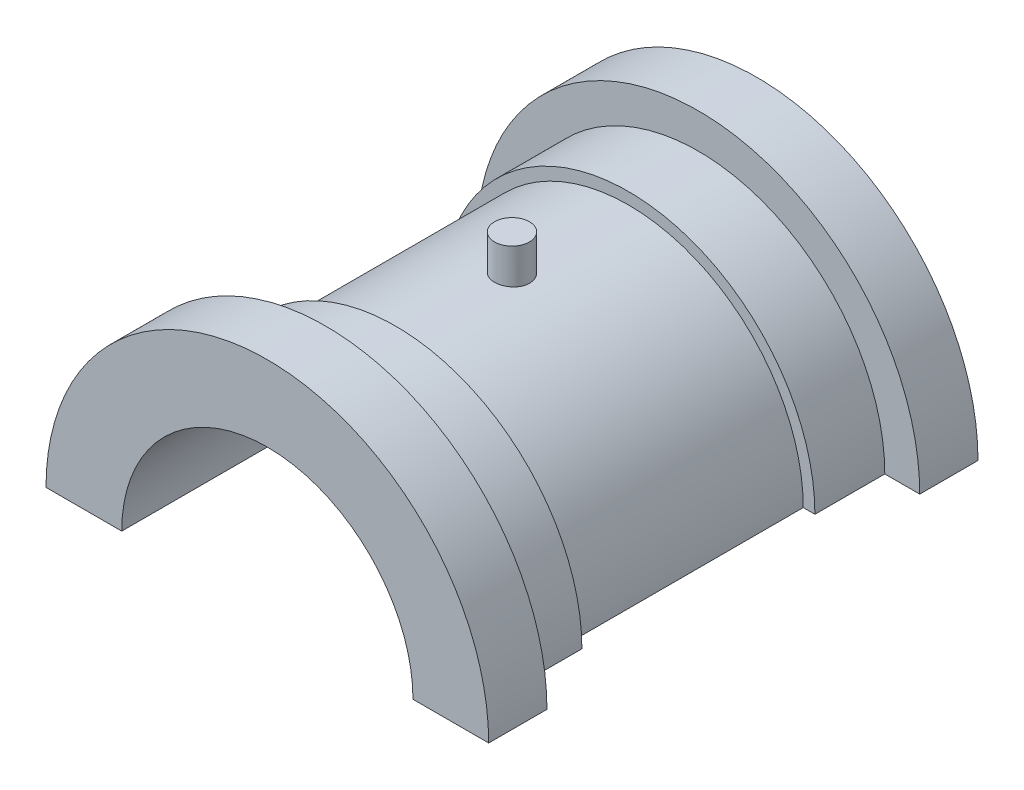
ISO-10303-21;
HEADER;
FILE_DESCRIPTION(('STEP AP214'),'2;1');
FILE_NAME('part.step','',(''),(''),'','','');
FILE_SCHEMA(('AUTOMOTIVE_DESIGN { 1 0 10303 214 1 1 1 1 }'));
ENDSEC;
DATA;
#1=APPLICATION_CONTEXT('core data for automotive mechanical design processes');
#2=APPLICATION_PROTOCOL_DEFINITION('international standard','automotive_design',2000,#1);
#3=PRODUCT_CONTEXT('',#1,'mechanical');
#4=PRODUCT('Part','Part','',(#3));
#5=PRODUCT_RELATED_PRODUCT_CATEGORY('part','',(#4));
#6=PRODUCT_DEFINITION_FORMATION('','',#4);
#7=PRODUCT_DEFINITION_CONTEXT('part definition',#1,'design');
#8=PRODUCT_DEFINITION('design','',#6,#7);
#9=PRODUCT_DEFINITION_SHAPE('','',#8);
#10=(LENGTH_UNIT() NAMED_UNIT(*) SI_UNIT(.MILLI.,.METRE.));
#11=(NAMED_UNIT(*) PLANE_ANGLE_UNIT() SI_UNIT($,.RADIAN.));
#12=(NAMED_UNIT(*) SI_UNIT($,.STERADIAN.) SOLID_ANGLE_UNIT());
#13=UNCERTAINTY_MEASURE_WITH_UNIT(LENGTH_MEASURE(1.E-05),#10,'distance_accuracy_value','');
#14=(GEOMETRIC_REPRESENTATION_CONTEXT(3) GLOBAL_UNCERTAINTY_ASSIGNED_CONTEXT((#13)) GLOBAL_UNIT_ASSIGNED_CONTEXT((#10,
#11,#12)) REPRESENTATION_CONTEXT('',''));
#15=CARTESIAN_POINT('',(0.,0.,0.));
#16=DIRECTION('',(0.,0.,1.));
#17=DIRECTION('',(1.,0.,0.));
#18=AXIS2_PLACEMENT_3D('',#15,#16,#17);
#19=CARTESIAN_POINT('',(0.,0.,0.));
#20=DIRECTION('',(0.,0.,1.));
#21=DIRECTION('',(1.,0.,0.));
#22=AXIS2_PLACEMENT_3D('',#19,#20,#21);
#23=CYLINDRICAL_SURFACE('',#22,30.);
#24=DIRECTION('',(0.,0.,1.));
#25=VECTOR('',#24,1.);
#26=CARTESIAN_POINT('',(30.,-1.04744440165294E-13,-20.));
#27=LINE('',#26,#25);
#28=CARTESIAN_POINT('',(30.,-1.04744440165294E-13,-20.));
#29=VERTEX_POINT('',#28);
#30=CARTESIAN_POINT('',(30.,-1.04744440165294E-13,20.));
#31=VERTEX_POINT('',#30);
#32=EDGE_CURVE('E191',#29,#31,#27,.T.);
#33=ORIENTED_EDGE('',*,*,#32,.F.);
#34=CARTESIAN_POINT('',(0.,0.,-20.));
#35=DIRECTION('',(0.,0.,1.));
#36=DIRECTION('',(1.,0.,0.));
#37=AXIS2_PLACEMENT_3D('',#34,#35,#36);
#38=CIRCLE('',#37,30.);
#39=CARTESIAN_POINT('',(-30.,-1.04744440165294E-13,-20.));
#40=VERTEX_POINT('',#39);
#41=EDGE_CURVE('E57',#29,#40,#38,.T.);
#42=ORIENTED_EDGE('',*,*,#41,.T.);
#43=DIRECTION('',(0.,0.,1.));
#44=VECTOR('',#43,1.);
#45=CARTESIAN_POINT('',(-30.,-1.04744440165294E-13,-20.));
#46=LINE('',#45,#44);
#47=CARTESIAN_POINT('',(-30.,-1.04744440165294E-13,20.));
#48=VERTEX_POINT('',#47);
#49=EDGE_CURVE('E175',#40,#48,#46,.T.);
#50=ORIENTED_EDGE('',*,*,#49,.T.);
#51=CARTESIAN_POINT('',(0.,0.,20.));
#52=DIRECTION('',(0.,0.,1.));
#53=DIRECTION('',(1.,0.,0.));
#54=AXIS2_PLACEMENT_3D('',#51,#52,#53);
#55=CIRCLE('',#54,30.);
#56=EDGE_CURVE('E226',#31,#48,#55,.T.);
#57=ORIENTED_EDGE('',*,*,#56,.F.);
#58=EDGE_LOOP('',(#33,#42,#50,#57));
#59=FACE_BOUND('',#58,.T.);
#60=CARTESIAN_POINT('',(0.,30.,-3.));
#61=CARTESIAN_POINT('',(-0.168061061374672,29.9999980656231,-2.99999272229886));
#62=CARTESIAN_POINT('',(-0.336233235503319,29.9985727678862,-2.98583019331067));
#63=CARTESIAN_POINT('',(-0.667915195490511,29.9930240278421,-2.92954688912872));
#64=CARTESIAN_POINT('',(-0.831419637506484,29.9888976130208,-2.88739531192623));
#65=CARTESIAN_POINT('',(-1.14891502636024,29.9784124368921,-2.7763732782065));
#66=CARTESIAN_POINT('',(-1.30291165384473,29.9720550240212,-2.70751895844458));
#67=CARTESIAN_POINT('',(-1.59712848288122,29.9578187218292,-2.54507727620507));
#68=CARTESIAN_POINT('',(-1.73735141633723,29.9499401351439,-2.45149483199959));
#69=CARTESIAN_POINT('',(-2.00057865202225,29.9335123302397,-2.24189190701318));
#70=CARTESIAN_POINT('',(-2.12352643450468,29.924961047216,-2.1258006017939));
#71=CARTESIAN_POINT('',(-2.34822756429295,29.9081687071879,-1.87462639721091));
#72=CARTESIAN_POINT('',(-2.44997993124796,29.8999276645475,-1.73954261987284));
#73=CARTESIAN_POINT('',(-2.62960191133085,29.8846677465835,-1.45386440494914));
#74=CARTESIAN_POINT('',(-2.70742039636464,29.8776515013271,-1.30323766771542));
#75=CARTESIAN_POINT('',(-2.83663915422828,29.8656611263957,-0.990973242285063));
#76=CARTESIAN_POINT('',(-2.88804007977387,29.8606869462667,-0.82933582624815));
#77=CARTESIAN_POINT('',(-2.96279712480568,29.8533625221893,-0.500214597401971));
#78=CARTESIAN_POINT('',(-2.98624695901139,29.8510035119429,-0.332752269443375));
#79=CARTESIAN_POINT('',(-3.00472585540608,29.8491492918158,0.00374659018734238));
#80=CARTESIAN_POINT('',(-2.9997556646124,29.8496540066624,0.172783080366179));
#81=CARTESIAN_POINT('',(-2.96161284075803,29.853462206968,0.506985929079956));
#82=CARTESIAN_POINT('',(-2.92854253237366,29.8567555377195,0.672164097986084));
#83=CARTESIAN_POINT('',(-2.83529743245176,29.8657540286225,0.994613889603283));
#84=CARTESIAN_POINT('',(-2.77512227476724,29.8714592213547,1.15188540547509));
#85=CARTESIAN_POINT('',(-2.62926268164452,29.8846502835621,1.45438076189667));
#86=CARTESIAN_POINT('',(-2.54353284815994,29.8921393172447,1.59958256846795));
#87=CARTESIAN_POINT('',(-2.34903008205968,29.9080515519864,1.87357564473565));
#88=CARTESIAN_POINT('',(-2.24025647500952,29.9164747803835,2.00236643394529));
#89=CARTESIAN_POINT('',(-2.00218233723621,29.9333515593897,2.24047618196708));
#90=CARTESIAN_POINT('',(-1.87279343655409,29.9418050799899,2.34970680564242));
#91=CARTESIAN_POINT('',(-1.59746844521134,29.9577548723555,2.54491089873116));
#92=CARTESIAN_POINT('',(-1.4515323359988,29.9652511430477,2.63088434206943));
#93=CARTESIAN_POINT('',(-1.14719431707709,29.9784442700129,2.77713006093076));
#94=CARTESIAN_POINT('',(-0.98879023916971,29.9841408124431,2.83739785445418));
#95=CARTESIAN_POINT('',(-0.664041651989797,29.9930894232422,2.93045675013526));
#96=CARTESIAN_POINT('',(-0.497697380329801,29.9963415647119,2.96324867397187));
#97=CARTESIAN_POINT('',(-0.162555297275712,30.0000255500493,3.0003129232043));
#98=CARTESIAN_POINT('',(0.00622890631647483,30.0004694480321,3.0047071447575));
#99=CARTESIAN_POINT('',(0.342131379947098,29.9985192527039,2.98517141085371));
#100=CARTESIAN_POINT('',(0.509249672461409,29.996125197734,2.96124183805416));
#101=CARTESIAN_POINT('',(0.836724620504023,29.9887758461758,2.88583891373527));
#102=CARTESIAN_POINT('',(0.997094546916057,29.9838258575412,2.83442263656597));
#103=CARTESIAN_POINT('',(1.30693296415134,29.9719199658183,2.70556447788819));
#104=CARTESIAN_POINT('',(1.45640121047135,29.9649640177576,2.62812201288181));
#105=CARTESIAN_POINT('',(1.74074454051643,29.9497942599127,2.44910748400826));
#106=CARTESIAN_POINT('',(1.87556897924675,29.9415763081032,2.34745533322255));
#107=CARTESIAN_POINT('',(2.12628486993563,29.9248179860856,2.12302179677722));
#108=CARTESIAN_POINT('',(2.24217584654753,29.9162776077891,2.00023988078905));
#109=CARTESIAN_POINT('',(2.45215832966144,29.8998007242226,1.736500276023));
#110=CARTESIAN_POINT('',(2.54616983603863,29.8918665041692,1.59547873037214));
#111=CARTESIAN_POINT('',(2.70917477623148,29.8775349738267,1.29957791955995));
#112=CARTESIAN_POINT('',(2.77816855216165,29.8711376425211,1.14469884393481));
#113=CARTESIAN_POINT('',(2.88904562605343,29.8606184290215,0.825753781602619));
#114=CARTESIAN_POINT('',(2.93097652443558,29.8564925534936,0.661704479726639));
#115=CARTESIAN_POINT('',(2.98669202138839,29.8509709584863,0.328850406117685));
#116=CARTESIAN_POINT('',(3.00047742719855,29.8495751607056,0.160045770912979));
#117=CARTESIAN_POINT('',(2.99949941541377,29.8496733932269,-0.176732065070113));
#118=CARTESIAN_POINT('',(2.98486166877934,29.8511547026103,-0.344705648648444));
#119=CARTESIAN_POINT('',(2.92771635889096,29.8568131166864,-0.675794751504863));
#120=CARTESIAN_POINT('',(2.88520876428648,29.8609902244115,-0.838910265317938));
#121=CARTESIAN_POINT('',(2.77356505889251,29.8715660478956,-1.15565204714357));
#122=CARTESIAN_POINT('',(2.70443263302275,29.8779644562108,-1.30927962488917));
#123=CARTESIAN_POINT('',(2.54151466473313,29.8922625551808,-1.6027706750131));
#124=CARTESIAN_POINT('',(2.44772926036624,29.9001622374285,-1.74263422446189));
#125=CARTESIAN_POINT('',(2.23769566885599,29.9166146162909,-2.00527102341581));
#126=CARTESIAN_POINT('',(2.12135384667081,29.9251699418025,-2.12796922910126));
#127=CARTESIAN_POINT('',(1.86969509767533,29.9419456418635,-2.35215669809897));
#128=CARTESIAN_POINT('',(1.73437363232477,29.9501659356893,-2.45364087407151));
#129=CARTESIAN_POINT('',(1.44822430248387,29.9653668620748,-2.63272036156386));
#130=CARTESIAN_POINT('',(1.29735824804029,29.9723443208044,-2.71025487283555));
#131=CARTESIAN_POINT('',(0.984774837301653,29.9842388774969,-2.8387872684716));
#132=CARTESIAN_POINT('',(0.82306994947683,29.9891582972896,-2.88981507286064));
#133=CARTESIAN_POINT('',(0.550374784217114,29.995146413212,-2.95116185125441));
#134=CARTESIAN_POINT('',(0.441127658533527,29.996958020755,-2.96945113289807));
#135=CARTESIAN_POINT('',(0.221269742451939,29.9993854485236,-2.99387257818529));
#136=CARTESIAN_POINT('',(0.110658957679674,30.0000012736807,-3.00000479196559));
#137=CARTESIAN_POINT('',(0.,30.,-3.));
#138=B_SPLINE_CURVE_WITH_KNOTS('',3,(#60,#61,#62,#63,#64,#65,#66,#67,#68,#69,#70,#71,#72,#73,
#74,#75,#76,#77,#78,#79,#80,#81,#82,#83,#84,#85,#86,#87,#88,#89,#90,#91,#92,#93,#94,#95,#96,#97,
#98,#99,#100,#101,#102,#103,#104,#105,#106,#107,#108,#109,#110,#111,#112,#113,#114,#115,#116,
#117,#118,#119,#120,#121,#122,#123,#124,#125,#126,#127,#128,#129,#130,#131,#132,#133,#134,#135,
#136,#137),.UNSPECIFIED.,.T.,.F.,(4,2,2,2,2,2,2,2,2,2,2,2,2,2,2,2,2,2,2,2,2,2,2,2,2,2,2,2,2,2,2,
2,2,2,2,2,2,2,4),(0.,0.503779098805421,1.00811352850646,1.51214365719661,2.01607361274835,
2.52161570586883,3.02718117662118,3.53381926416665,4.04044483327512,4.5453669613559,
5.0502758176733,5.55335392323332,6.05643882484901,6.56042284118684,7.06442160993376,
7.5706420258862,8.07686300939315,8.58317222080744,9.08946629026318,9.59358565823273,
10.0976982155743,10.6007680588291,11.103849181484,11.608618222461,12.1133999343069,
12.619999308258,13.1265917542612,13.6322907177901,14.1379751771876,14.6414288788187,
15.1448831467812,15.648267760884,16.1516495561688,16.6571675228296,17.1628065791087,
17.6697189307873,18.1760578438589,18.5077700169705,18.8394808220708),.UNSPECIFIED.);
#139=CARTESIAN_POINT('',(0.,30.,-3.));
#140=VERTEX_POINT('',#139);
#141=EDGE_CURVE('E11',#140,#140,#138,.T.);
#142=ORIENTED_EDGE('',*,*,#141,.F.);
#143=EDGE_LOOP('',(#142));
#144=FACE_BOUND('',#143,.T.);
#145=ADVANCED_FACE('F37',(#59,#144),#23,.T.);
#146=CARTESIAN_POINT('',(0.,0.,0.));
#147=DIRECTION('',(0.,0.,1.));
#148=DIRECTION('',(1.,0.,0.));
#149=AXIS2_PLACEMENT_3D('',#146,#147,#148);
#150=CYLINDRICAL_SURFACE('',#149,25.);
#151=CARTESIAN_POINT('',(0.,0.,-42.));
#152=DIRECTION('',(0.,0.,1.));
#153=DIRECTION('',(1.,0.,0.));
#154=AXIS2_PLACEMENT_3D('',#151,#152,#153);
#155=CIRCLE('',#154,25.);
#156=CARTESIAN_POINT('',(25.,0.,-42.));
#157=VERTEX_POINT('',#156);
#158=CARTESIAN_POINT('',(-25.,0.,-42.));
#159=VERTEX_POINT('',#158);
#160=EDGE_CURVE('E50',#157,#159,#155,.T.);
#161=ORIENTED_EDGE('',*,*,#160,.F.);
#162=DIRECTION('',(0.,0.,-1.));
#163=VECTOR('',#162,1.);
#164=CARTESIAN_POINT('',(25.,0.,0.));
#165=LINE('',#164,#163);
#166=CARTESIAN_POINT('',(25.,0.,42.));
#167=VERTEX_POINT('',#166);
#168=EDGE_CURVE('E157',#167,#157,#165,.T.);
#169=ORIENTED_EDGE('',*,*,#168,.F.);
#170=CARTESIAN_POINT('',(0.,0.,42.));
#171=DIRECTION('',(0.,0.,1.));
#172=DIRECTION('',(1.,0.,0.));
#173=AXIS2_PLACEMENT_3D('',#170,#171,#172);
#174=CIRCLE('',#173,25.);
#175=CARTESIAN_POINT('',(-25.,0.,42.));
#176=VERTEX_POINT('',#175);
#177=EDGE_CURVE('E145',#167,#176,#174,.T.);
#178=ORIENTED_EDGE('',*,*,#177,.T.);
#179=DIRECTION('',(0.,0.,-1.));
#180=VECTOR('',#179,1.);
#181=CARTESIAN_POINT('',(-25.,0.,0.));
#182=LINE('',#181,#180);
#183=EDGE_CURVE('E134',#176,#159,#182,.T.);
#184=ORIENTED_EDGE('',*,*,#183,.T.);
#185=EDGE_LOOP('',(#161,#169,#178,#184));
#186=FACE_BOUND('',#185,.T.);
#187=ADVANCED_FACE('F39',(#186),#150,.F.);
#188=CARTESIAN_POINT('',(25.,0.,-42.));
#189=DIRECTION('',(0.,0.,1.));
#190=DIRECTION('',(1.,0.,0.));
#191=AXIS2_PLACEMENT_3D('',#188,#189,#190);
#192=PLANE('',#191);
#193=CARTESIAN_POINT('',(0.,0.,-42.));
#194=DIRECTION('',(0.,0.,1.));
#195=DIRECTION('',(1.,0.,0.));
#196=AXIS2_PLACEMENT_3D('',#193,#194,#195);
#197=CIRCLE('',#196,38.);
#198=CARTESIAN_POINT('',(38.,-1.32676290876039E-13,-42.));
#199=VERTEX_POINT('',#198);
#200=CARTESIAN_POINT('',(-38.,-1.32676290876039E-13,-42.));
#201=VERTEX_POINT('',#200);
#202=EDGE_CURVE('E199',#199,#201,#197,.T.);
#203=ORIENTED_EDGE('',*,*,#202,.F.);
#204=DIRECTION('',(1.,0.,0.));
#205=VECTOR('',#204,1.);
#206=CARTESIAN_POINT('',(25.,0.,-42.));
#207=LINE('',#206,#205);
#208=EDGE_CURVE('E178',#157,#199,#207,.T.);
#209=ORIENTED_EDGE('',*,*,#208,.F.);
#210=ORIENTED_EDGE('',*,*,#160,.T.);
#211=DIRECTION('',(-1.,0.,0.));
#212=VECTOR('',#211,1.);
#213=CARTESIAN_POINT('',(-25.,0.,-42.));
#214=LINE('',#213,#212);
#215=EDGE_CURVE('E142',#159,#201,#214,.T.);
#216=ORIENTED_EDGE('',*,*,#215,.T.);
#217=EDGE_LOOP('',(#203,#209,#210,#216));
#218=FACE_BOUND('',#217,.T.);
#219=ADVANCED_FACE('F202',(#218),#192,.F.);
#220=CARTESIAN_POINT('',(0.,0.,0.));
#221=DIRECTION('',(0.,0.,1.));
#222=DIRECTION('',(1.,0.,0.));
#223=AXIS2_PLACEMENT_3D('',#220,#221,#222);
#224=CYLINDRICAL_SURFACE('',#223,38.);
#225=CARTESIAN_POINT('',(0.,0.,-32.));
#226=DIRECTION('',(0.,0.,1.));
#227=DIRECTION('',(1.,0.,0.));
#228=AXIS2_PLACEMENT_3D('',#225,#226,#227);
#229=CIRCLE('',#228,38.);
#230=CARTESIAN_POINT('',(38.,-1.32676290876039E-13,-32.));
#231=VERTEX_POINT('',#230);
#232=CARTESIAN_POINT('',(-38.,-1.32676290876039E-13,-32.));
#233=VERTEX_POINT('',#232);
#234=EDGE_CURVE('E197',#231,#233,#229,.T.);
#235=ORIENTED_EDGE('',*,*,#234,.F.);
#236=DIRECTION('',(0.,0.,1.));
#237=VECTOR('',#236,1.);
#238=CARTESIAN_POINT('',(38.,-1.32676290876039E-13,-42.));
#239=LINE('',#238,#237);
#240=EDGE_CURVE('E181',#199,#231,#239,.T.);
#241=ORIENTED_EDGE('',*,*,#240,.F.);
#242=ORIENTED_EDGE('',*,*,#202,.T.);
#243=DIRECTION('',(0.,0.,1.));
#244=VECTOR('',#243,1.);
#245=CARTESIAN_POINT('',(-38.,-1.32676290876039E-13,-42.));
#246=LINE('',#245,#244);
#247=EDGE_CURVE('E165',#201,#233,#246,.T.);
#248=ORIENTED_EDGE('',*,*,#247,.T.);
#249=EDGE_LOOP('',(#235,#241,#242,#248));
#250=FACE_BOUND('',#249,.T.);
#251=ADVANCED_FACE('F266',(#250),#224,.T.);
#252=CARTESIAN_POINT('',(38.,-1.32676290876039E-13,-32.));
#253=DIRECTION('',(0.,0.,-1.));
#254=DIRECTION('',(-1.,0.,0.));
#255=AXIS2_PLACEMENT_3D('',#252,#253,#254);
#256=PLANE('',#255);
#257=CARTESIAN_POINT('',(0.,0.,-32.));
#258=DIRECTION('',(0.,0.,1.));
#259=DIRECTION('',(1.,0.,0.));
#260=AXIS2_PLACEMENT_3D('',#257,#258,#259);
#261=CIRCLE('',#260,32.);
#262=CARTESIAN_POINT('',(32.,-1.1172740284298E-13,-32.));
#263=VERTEX_POINT('',#262);
#264=CARTESIAN_POINT('',(-32.,-1.1172740284298E-13,-32.));
#265=VERTEX_POINT('',#264);
#266=EDGE_CURVE('E195',#263,#265,#261,.T.);
#267=ORIENTED_EDGE('',*,*,#266,.F.);
#268=DIRECTION('',(-1.,0.,0.));
#269=VECTOR('',#268,1.);
#270=CARTESIAN_POINT('',(38.,-1.32676290876039E-13,-32.));
#271=LINE('',#270,#269);
#272=EDGE_CURVE('E184',#231,#263,#271,.T.);
#273=ORIENTED_EDGE('',*,*,#272,.F.);
#274=ORIENTED_EDGE('',*,*,#234,.T.);
#275=DIRECTION('',(1.,0.,0.));
#276=VECTOR('',#275,1.);
#277=CARTESIAN_POINT('',(-38.,-1.32676290876039E-13,-32.));
#278=LINE('',#277,#276);
#279=EDGE_CURVE('E168',#233,#265,#278,.T.);
#280=ORIENTED_EDGE('',*,*,#279,.T.);
#281=EDGE_LOOP('',(#267,#273,#274,#280));
#282=FACE_BOUND('',#281,.T.);
#283=ADVANCED_FACE('F264',(#282),#256,.F.);
#284=CARTESIAN_POINT('',(0.,0.,0.));
#285=DIRECTION('',(0.,0.,1.));
#286=DIRECTION('',(1.,0.,0.));
#287=AXIS2_PLACEMENT_3D('',#284,#285,#286);
#288=CYLINDRICAL_SURFACE('',#287,32.);
#289=CARTESIAN_POINT('',(0.,0.,-20.));
#290=DIRECTION('',(0.,0.,1.));
#291=DIRECTION('',(1.,0.,0.));
#292=AXIS2_PLACEMENT_3D('',#289,#290,#291);
#293=CIRCLE('',#292,32.);
#294=CARTESIAN_POINT('',(32.,-1.1172740284298E-13,-20.));
#295=VERTEX_POINT('',#294);
#296=CARTESIAN_POINT('',(-32.,-1.1172740284298E-13,-20.));
#297=VERTEX_POINT('',#296);
#298=EDGE_CURVE('E65',#295,#297,#293,.T.);
#299=ORIENTED_EDGE('',*,*,#298,.F.);
#300=DIRECTION('',(0.,0.,1.));
#301=VECTOR('',#300,1.);
#302=CARTESIAN_POINT('',(32.,-1.1172740284298E-13,-32.));
#303=LINE('',#302,#301);
#304=EDGE_CURVE('E187',#263,#295,#303,.T.);
#305=ORIENTED_EDGE('',*,*,#304,.F.);
#306=ORIENTED_EDGE('',*,*,#266,.T.);
#307=DIRECTION('',(0.,0.,1.));
#308=VECTOR('',#307,1.);
#309=CARTESIAN_POINT('',(-32.,-1.1172740284298E-13,-32.));
#310=LINE('',#309,#308);
#311=EDGE_CURVE('E171',#265,#297,#310,.T.);
#312=ORIENTED_EDGE('',*,*,#311,.T.);
#313=EDGE_LOOP('',(#299,#305,#306,#312));
#314=FACE_BOUND('',#313,.T.);
#315=ADVANCED_FACE('F261',(#314),#288,.T.);
#316=CARTESIAN_POINT('',(32.,-1.1172740284298E-13,-20.));
#317=DIRECTION('',(0.,0.,-1.));
#318=DIRECTION('',(-1.,0.,0.));
#319=AXIS2_PLACEMENT_3D('',#316,#317,#318);
#320=PLANE('',#319);
#321=ORIENTED_EDGE('',*,*,#41,.F.);
#322=DIRECTION('',(-1.,0.,0.));
#323=VECTOR('',#322,1.);
#324=CARTESIAN_POINT('',(32.,-1.1172740284298E-13,-20.));
#325=LINE('',#324,#323);
#326=EDGE_CURVE('E189',#295,#29,#325,.T.);
#327=ORIENTED_EDGE('',*,*,#326,.F.);
#328=ORIENTED_EDGE('',*,*,#298,.T.);
#329=DIRECTION('',(1.,0.,0.));
#330=VECTOR('',#329,1.);
#331=CARTESIAN_POINT('',(-32.,-1.1172740284298E-13,-20.));
#332=LINE('',#331,#330);
#333=EDGE_CURVE('E173',#297,#40,#332,.T.);
#334=ORIENTED_EDGE('',*,*,#333,.T.);
#335=EDGE_LOOP('',(#321,#327,#328,#334));
#336=FACE_BOUND('',#335,.T.);
#337=ADVANCED_FACE('F260',(#336),#320,.F.);
#338=CARTESIAN_POINT('',(0.,0.,0.));
#339=DIRECTION('',(0.,-1.,0.));
#340=DIRECTION('',(0.,0.,-1.));
#341=AXIS2_PLACEMENT_3D('',#338,#339,#340);
#342=PLANE('',#341);
#343=ORIENTED_EDGE('',*,*,#32,.T.);
#344=DIRECTION('',(-1.,0.,0.));
#345=VECTOR('',#344,1.);
#346=CARTESIAN_POINT('',(32.,-1.1172740284298E-13,20.));
#347=LINE('',#346,#345);
#348=CARTESIAN_POINT('',(32.,-1.1172740284298E-13,20.));
#349=VERTEX_POINT('',#348);
#350=EDGE_CURVE('E223',#349,#31,#347,.T.);
#351=ORIENTED_EDGE('',*,*,#350,.F.);
#352=DIRECTION('',(0.,0.,-1.));
#353=VECTOR('',#352,1.);
#354=CARTESIAN_POINT('',(32.,-1.1172740284298E-13,32.));
#355=LINE('',#354,#353);
#356=CARTESIAN_POINT('',(32.,-1.1172740284298E-13,32.));
#357=VERTEX_POINT('',#356);
#358=EDGE_CURVE('E220',#357,#349,#355,.T.);
#359=ORIENTED_EDGE('',*,*,#358,.F.);
#360=DIRECTION('',(-1.,0.,0.));
#361=VECTOR('',#360,1.);
#362=CARTESIAN_POINT('',(38.,-1.32676290876039E-13,32.));
#363=LINE('',#362,#361);
#364=CARTESIAN_POINT('',(38.,-1.32676290876039E-13,32.));
#365=VERTEX_POINT('',#364);
#366=EDGE_CURVE('E211',#365,#357,#363,.T.);
#367=ORIENTED_EDGE('',*,*,#366,.F.);
#368=DIRECTION('',(0.,0.,-1.));
#369=VECTOR('',#368,1.);
#370=CARTESIAN_POINT('',(38.,-1.32676290876039E-13,42.));
#371=LINE('',#370,#369);
#372=CARTESIAN_POINT('',(38.,-1.32676290876039E-13,42.));
#373=VERTEX_POINT('',#372);
#374=EDGE_CURVE('E208',#373,#365,#371,.T.);
#375=ORIENTED_EDGE('',*,*,#374,.F.);
#376=DIRECTION('',(1.,0.,0.));
#377=VECTOR('',#376,1.);
#378=CARTESIAN_POINT('',(25.,0.,42.));
#379=LINE('',#378,#377);
#380=EDGE_CURVE('E206',#167,#373,#379,.T.);
#381=ORIENTED_EDGE('',*,*,#380,.F.);
#382=ORIENTED_EDGE('',*,*,#168,.T.);
#383=ORIENTED_EDGE('',*,*,#208,.T.);
#384=ORIENTED_EDGE('',*,*,#240,.T.);
#385=ORIENTED_EDGE('',*,*,#272,.T.);
#386=ORIENTED_EDGE('',*,*,#304,.T.);
#387=ORIENTED_EDGE('',*,*,#326,.T.);
#388=EDGE_LOOP('',(#343,#351,#359,#367,#375,#381,#382,#383,#384,#385,#386,#387));
#389=FACE_BOUND('',#388,.T.);
#390=ADVANCED_FACE('F204',(#389),#342,.T.);
#391=CARTESIAN_POINT('',(0.,0.,0.));
#392=DIRECTION('',(0.,1.,0.));
#393=DIRECTION('',(0.,0.,-1.));
#394=AXIS2_PLACEMENT_3D('',#391,#392,#393);
#395=PLANE('',#394);
#396=ORIENTED_EDGE('',*,*,#183,.F.);
#397=DIRECTION('',(-1.,0.,0.));
#398=VECTOR('',#397,1.);
#399=CARTESIAN_POINT('',(-25.,0.,42.));
#400=LINE('',#399,#398);
#401=CARTESIAN_POINT('',(-38.,-1.32676290876039E-13,42.));
#402=VERTEX_POINT('',#401);
#403=EDGE_CURVE('E138',#176,#402,#400,.T.);
#404=ORIENTED_EDGE('',*,*,#403,.T.);
#405=DIRECTION('',(0.,0.,-1.));
#406=VECTOR('',#405,1.);
#407=CARTESIAN_POINT('',(-38.,-1.32676290876039E-13,42.));
#408=LINE('',#407,#406);
#409=CARTESIAN_POINT('',(-38.,-1.32676290876039E-13,32.));
#410=VERTEX_POINT('',#409);
#411=EDGE_CURVE('E153',#402,#410,#408,.T.);
#412=ORIENTED_EDGE('',*,*,#411,.T.);
#413=DIRECTION('',(1.,0.,0.));
#414=VECTOR('',#413,1.);
#415=CARTESIAN_POINT('',(-38.,-1.32676290876039E-13,32.));
#416=LINE('',#415,#414);
#417=CARTESIAN_POINT('',(-32.,-1.1172740284298E-13,32.));
#418=VERTEX_POINT('',#417);
#419=EDGE_CURVE('E242',#410,#418,#416,.T.);
#420=ORIENTED_EDGE('',*,*,#419,.T.);
#421=DIRECTION('',(0.,0.,-1.));
#422=VECTOR('',#421,1.);
#423=CARTESIAN_POINT('',(-32.,-1.1172740284298E-13,32.));
#424=LINE('',#423,#422);
#425=CARTESIAN_POINT('',(-32.,-1.1172740284298E-13,20.));
#426=VERTEX_POINT('',#425);
#427=EDGE_CURVE('E214',#418,#426,#424,.T.);
#428=ORIENTED_EDGE('',*,*,#427,.T.);
#429=DIRECTION('',(1.,0.,0.));
#430=VECTOR('',#429,1.);
#431=CARTESIAN_POINT('',(-32.,-1.1172740284298E-13,20.));
#432=LINE('',#431,#430);
#433=EDGE_CURVE('E209',#426,#48,#432,.T.);
#434=ORIENTED_EDGE('',*,*,#433,.T.);
#435=ORIENTED_EDGE('',*,*,#49,.F.);
#436=ORIENTED_EDGE('',*,*,#333,.F.);
#437=ORIENTED_EDGE('',*,*,#311,.F.);
#438=ORIENTED_EDGE('',*,*,#279,.F.);
#439=ORIENTED_EDGE('',*,*,#247,.F.);
#440=ORIENTED_EDGE('',*,*,#215,.F.);
#441=EDGE_LOOP('',(#396,#404,#412,#420,#428,#434,#435,#436,#437,#438,#439,#440));
#442=FACE_BOUND('',#441,.T.);
#443=ADVANCED_FACE('F136',(#442),#395,.F.);
#444=CARTESIAN_POINT('',(25.,0.,42.));
#445=DIRECTION('',(0.,0.,-1.));
#446=DIRECTION('',(1.,0.,0.));
#447=AXIS2_PLACEMENT_3D('',#444,#445,#446);
#448=PLANE('',#447);
#449=CARTESIAN_POINT('',(0.,0.,42.));
#450=DIRECTION('',(0.,0.,1.));
#451=DIRECTION('',(1.,0.,0.));
#452=AXIS2_PLACEMENT_3D('',#449,#450,#451);
#453=CIRCLE('',#452,38.);
#454=EDGE_CURVE('E152',#373,#402,#453,.T.);
#455=ORIENTED_EDGE('',*,*,#454,.T.);
#456=ORIENTED_EDGE('',*,*,#403,.F.);
#457=ORIENTED_EDGE('',*,*,#177,.F.);
#458=ORIENTED_EDGE('',*,*,#380,.T.);
#459=EDGE_LOOP('',(#455,#456,#457,#458));
#460=FACE_BOUND('',#459,.T.);
#461=ADVANCED_FACE('F149',(#460),#448,.F.);
#462=CARTESIAN_POINT('',(0.,0.,0.));
#463=DIRECTION('',(0.,0.,-1.));
#464=DIRECTION('',(1.,0.,0.));
#465=AXIS2_PLACEMENT_3D('',#462,#463,#464);
#466=CYLINDRICAL_SURFACE('',#465,38.);
#467=CARTESIAN_POINT('',(0.,0.,32.));
#468=DIRECTION('',(0.,0.,1.));
#469=DIRECTION('',(1.,0.,0.));
#470=AXIS2_PLACEMENT_3D('',#467,#468,#469);
#471=CIRCLE('',#470,38.);
#472=EDGE_CURVE('E160',#365,#410,#471,.T.);
#473=ORIENTED_EDGE('',*,*,#472,.T.);
#474=ORIENTED_EDGE('',*,*,#411,.F.);
#475=ORIENTED_EDGE('',*,*,#454,.F.);
#476=ORIENTED_EDGE('',*,*,#374,.T.);
#477=EDGE_LOOP('',(#473,#474,#475,#476));
#478=FACE_BOUND('',#477,.T.);
#479=ADVANCED_FACE('F237',(#478),#466,.T.);
#480=CARTESIAN_POINT('',(38.,-1.32676290876039E-13,32.));
#481=DIRECTION('',(0.,0.,1.));
#482=DIRECTION('',(-1.,0.,0.));
#483=AXIS2_PLACEMENT_3D('',#480,#481,#482);
#484=PLANE('',#483);
#485=CARTESIAN_POINT('',(0.,0.,32.));
#486=DIRECTION('',(0.,0.,1.));
#487=DIRECTION('',(1.,0.,0.));
#488=AXIS2_PLACEMENT_3D('',#485,#486,#487);
#489=CIRCLE('',#488,32.);
#490=EDGE_CURVE('E232',#357,#418,#489,.T.);
#491=ORIENTED_EDGE('',*,*,#490,.T.);
#492=ORIENTED_EDGE('',*,*,#419,.F.);
#493=ORIENTED_EDGE('',*,*,#472,.F.);
#494=ORIENTED_EDGE('',*,*,#366,.T.);
#495=EDGE_LOOP('',(#491,#492,#493,#494));
#496=FACE_BOUND('',#495,.T.);
#497=ADVANCED_FACE('F239',(#496),#484,.F.);
#498=CARTESIAN_POINT('',(0.,0.,0.));
#499=DIRECTION('',(0.,0.,-1.));
#500=DIRECTION('',(1.,0.,0.));
#501=AXIS2_PLACEMENT_3D('',#498,#499,#500);
#502=CYLINDRICAL_SURFACE('',#501,32.);
#503=CARTESIAN_POINT('',(0.,0.,20.));
#504=DIRECTION('',(0.,0.,1.));
#505=DIRECTION('',(1.,0.,0.));
#506=AXIS2_PLACEMENT_3D('',#503,#504,#505);
#507=CIRCLE('',#506,32.);
#508=EDGE_CURVE('E229',#349,#426,#507,.T.);
#509=ORIENTED_EDGE('',*,*,#508,.T.);
#510=ORIENTED_EDGE('',*,*,#427,.F.);
#511=ORIENTED_EDGE('',*,*,#490,.F.);
#512=ORIENTED_EDGE('',*,*,#358,.T.);
#513=EDGE_LOOP('',(#509,#510,#511,#512));
#514=FACE_BOUND('',#513,.T.);
#515=ADVANCED_FACE('F250',(#514),#502,.T.);
#516=CARTESIAN_POINT('',(32.,-1.1172740284298E-13,20.));
#517=DIRECTION('',(0.,0.,1.));
#518=DIRECTION('',(-1.,0.,0.));
#519=AXIS2_PLACEMENT_3D('',#516,#517,#518);
#520=PLANE('',#519);
#521=ORIENTED_EDGE('',*,*,#56,.T.);
#522=ORIENTED_EDGE('',*,*,#433,.F.);
#523=ORIENTED_EDGE('',*,*,#508,.F.);
#524=ORIENTED_EDGE('',*,*,#350,.T.);
#525=EDGE_LOOP('',(#521,#522,#523,#524));
#526=FACE_BOUND('',#525,.T.);
#527=ADVANCED_FACE('F252',(#526),#520,.F.);
#528=CARTESIAN_POINT('',(0.,36.,0.));
#529=DIRECTION('',(0.,-1.,0.));
#530=DIRECTION('',(0.,0.,-1.));
#531=AXIS2_PLACEMENT_3D('',#528,#529,#530);
#532=CYLINDRICAL_SURFACE('',#531,3.);
#533=CARTESIAN_POINT('',(0.,36.,0.));
#534=DIRECTION('',(0.,1.,0.));
#535=DIRECTION('',(0.,0.,1.));
#536=AXIS2_PLACEMENT_3D('',#533,#534,#535);
#537=CIRCLE('',#536,3.);
#538=CARTESIAN_POINT('',(0.,36.,3.));
#539=VERTEX_POINT('',#538);
#540=EDGE_CURVE('E154',#539,#539,#537,.T.);
#541=ORIENTED_EDGE('',*,*,#540,.F.);
#542=EDGE_LOOP('',(#541));
#543=FACE_BOUND('',#542,.T.);
#544=ORIENTED_EDGE('',*,*,#141,.T.);
#545=EDGE_LOOP('',(#544));
#546=FACE_BOUND('',#545,.T.);
#547=ADVANCED_FACE('F334',(#543,#546),#532,.T.);
#548=CARTESIAN_POINT('',(0.,36.,0.));
#549=DIRECTION('',(0.,1.,0.));
#550=DIRECTION('',(0.,0.,1.));
#551=AXIS2_PLACEMENT_3D('',#548,#549,#550);
#552=PLANE('',#551);
#553=ORIENTED_EDGE('',*,*,#540,.T.);
#554=EDGE_LOOP('',(#553));
#555=FACE_BOUND('',#554,.T.);
#556=ADVANCED_FACE('F341',(#555),#552,.T.);
#557=CLOSED_SHELL('',(#145,#187,#219,#251,#283,#315,#337,#390,#443,#461,#479,#497,#515,#527,
#547,#556));
#558=MANIFOLD_SOLID_BREP('B2',#557);
#559=ADVANCED_BREP_SHAPE_REPRESENTATION('',(#18,#558),#14);
#560=SHAPE_DEFINITION_REPRESENTATION(#9,#559);
ENDSEC;
END-ISO-10303-21;
